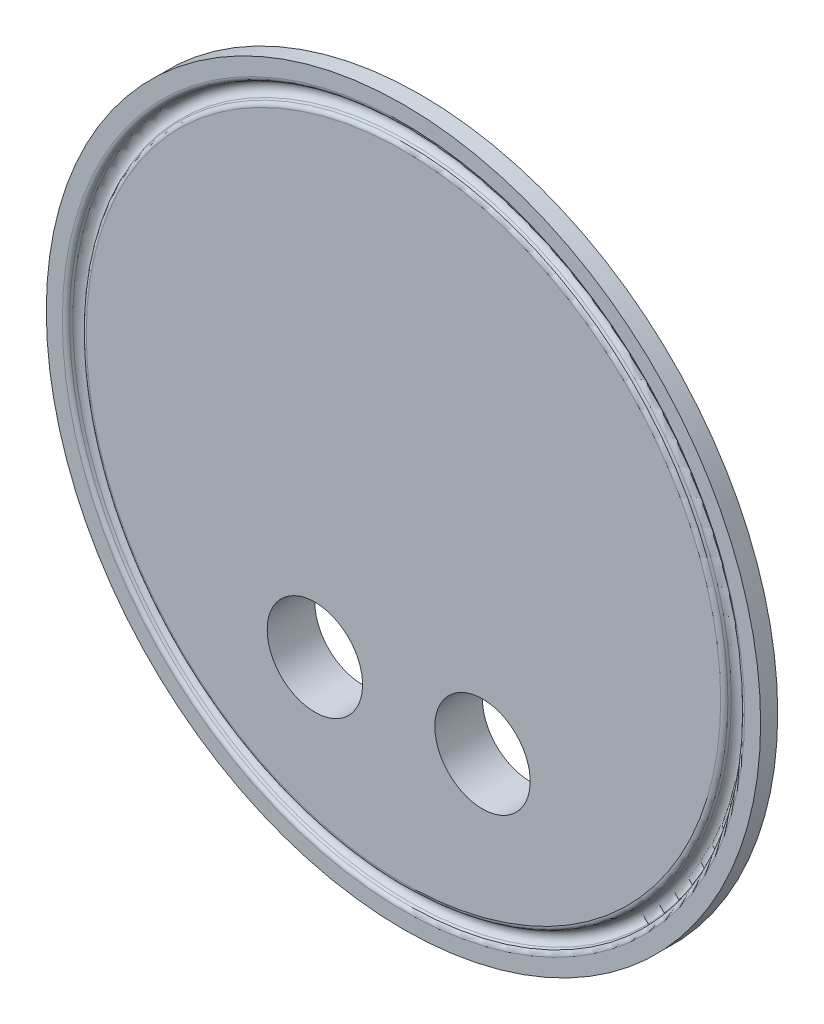
ISO-10303-21;
HEADER;
FILE_DESCRIPTION(('STEP AP214'),'2;1');
FILE_NAME('part.step','',(''),(''),'','','');
FILE_SCHEMA(('AUTOMOTIVE_DESIGN { 1 0 10303 214 1 1 1 1 }'));
ENDSEC;
DATA;
#1=APPLICATION_CONTEXT('core data for automotive mechanical design processes');
#2=APPLICATION_PROTOCOL_DEFINITION('international standard','automotive_design',2000,#1);
#3=PRODUCT_CONTEXT('',#1,'mechanical');
#4=PRODUCT('Part','Part','',(#3));
#5=PRODUCT_RELATED_PRODUCT_CATEGORY('part','',(#4));
#6=PRODUCT_DEFINITION_FORMATION('','',#4);
#7=PRODUCT_DEFINITION_CONTEXT('part definition',#1,'design');
#8=PRODUCT_DEFINITION('design','',#6,#7);
#9=PRODUCT_DEFINITION_SHAPE('','',#8);
#10=(LENGTH_UNIT() NAMED_UNIT(*) SI_UNIT(.MILLI.,.METRE.));
#11=(NAMED_UNIT(*) PLANE_ANGLE_UNIT() SI_UNIT($,.RADIAN.));
#12=(NAMED_UNIT(*) SI_UNIT($,.STERADIAN.) SOLID_ANGLE_UNIT());
#13=UNCERTAINTY_MEASURE_WITH_UNIT(LENGTH_MEASURE(1.E-05),#10,'distance_accuracy_value','');
#14=(GEOMETRIC_REPRESENTATION_CONTEXT(3) GLOBAL_UNCERTAINTY_ASSIGNED_CONTEXT((#13)) GLOBAL_UNIT_ASSIGNED_CONTEXT((#10,
#11,#12)) REPRESENTATION_CONTEXT('',''));
#15=CARTESIAN_POINT('',(0.,0.,0.));
#16=DIRECTION('',(0.,0.,1.));
#17=DIRECTION('',(1.,0.,0.));
#18=AXIS2_PLACEMENT_3D('',#15,#16,#17);
#19=CARTESIAN_POINT('',(0.,45.5042147091706,-7.9248));
#20=DIRECTION('',(0.,0.,1.));
#21=DIRECTION('',(1.,0.,0.));
#22=AXIS2_PLACEMENT_3D('',#19,#20,#21);
#23=PLANE('',#22);
#24=CARTESIAN_POINT('',(13.158980506847,-27.5862964842334,-7.9248));
#25=DIRECTION('',(0.,0.,-1.));
#26=DIRECTION('',(-1.,0.,0.));
#27=AXIS2_PLACEMENT_3D('',#24,#25,#26);
#28=CIRCLE('',#27,7.9375);
#29=CARTESIAN_POINT('',(5.22148050684697,-27.5862964842334,-7.9248));
#30=VERTEX_POINT('',#29);
#31=EDGE_CURVE('E98',#30,#30,#28,.T.);
#32=ORIENTED_EDGE('',*,*,#31,.F.);
#33=EDGE_LOOP('',(#32));
#34=FACE_BOUND('',#33,.T.);
#35=CARTESIAN_POINT('',(-14.7443998450213,-27.5862964842334,-7.9248));
#36=DIRECTION('',(0.,0.,-1.));
#37=DIRECTION('',(-1.,0.,0.));
#38=AXIS2_PLACEMENT_3D('',#35,#36,#37);
#39=CIRCLE('',#38,7.9375);
#40=CARTESIAN_POINT('',(-22.6818998450213,-27.5862964842334,-7.9248));
#41=VERTEX_POINT('',#40);
#42=EDGE_CURVE('E93',#41,#41,#39,.T.);
#43=ORIENTED_EDGE('',*,*,#42,.F.);
#44=EDGE_LOOP('',(#43));
#45=FACE_BOUND('',#44,.T.);
#46=CARTESIAN_POINT('',(0.,0.,-7.9248));
#47=DIRECTION('',(0.,0.,1.));
#48=DIRECTION('',(1.,0.,0.));
#49=AXIS2_PLACEMENT_3D('',#46,#47,#48);
#50=CIRCLE('',#49,45.5042147091706);
#51=CARTESIAN_POINT('',(45.5042147091706,0.,-7.9248));
#52=VERTEX_POINT('',#51);
#53=EDGE_CURVE('E11',#52,#52,#50,.T.);
#54=ORIENTED_EDGE('',*,*,#53,.F.);
#55=EDGE_LOOP('',(#54));
#56=FACE_BOUND('',#55,.T.);
#57=ADVANCED_FACE('F44',(#34,#45,#56),#23,.F.);
#58=CARTESIAN_POINT('',(0.,0.,-7.9248));
#59=DIRECTION('',(0.,0.,1.));
#60=DIRECTION('',(1.,0.,0.));
#61=AXIS2_PLACEMENT_3D('',#58,#59,#60);
#62=CONICAL_SURFACE('',#61,45.5042147091706,1.22173047639603);
#63=CARTESIAN_POINT('',(0.,0.,-2.8448));
#64=DIRECTION('',(0.,0.,1.));
#65=DIRECTION('',(1.,0.,0.));
#66=AXIS2_PLACEMENT_3D('',#63,#64,#65);
#67=CIRCLE('',#66,59.4614);
#68=CARTESIAN_POINT('',(59.4614,0.,-2.8448));
#69=VERTEX_POINT('',#68);
#70=EDGE_CURVE('E52',#69,#69,#67,.T.);
#71=ORIENTED_EDGE('',*,*,#70,.F.);
#72=EDGE_LOOP('',(#71));
#73=FACE_BOUND('',#72,.T.);
#74=ORIENTED_EDGE('',*,*,#53,.T.);
#75=EDGE_LOOP('',(#74));
#76=FACE_BOUND('',#75,.T.);
#77=ADVANCED_FACE('F120',(#73,#76),#62,.T.);
#78=CARTESIAN_POINT('',(0.,0.,0.));
#79=DIRECTION('',(0.,0.,1.));
#80=DIRECTION('',(1.,0.,0.));
#81=AXIS2_PLACEMENT_3D('',#78,#79,#80);
#82=CYLINDRICAL_SURFACE('',#81,59.4614);
#83=CARTESIAN_POINT('',(0.,0.,0.));
#84=DIRECTION('',(0.,0.,1.));
#85=DIRECTION('',(1.,0.,0.));
#86=AXIS2_PLACEMENT_3D('',#83,#84,#85);
#87=CIRCLE('',#86,59.4614);
#88=CARTESIAN_POINT('',(59.4614,0.,0.));
#89=VERTEX_POINT('',#88);
#90=EDGE_CURVE('E57',#89,#89,#87,.T.);
#91=ORIENTED_EDGE('',*,*,#90,.F.);
#92=EDGE_LOOP('',(#91));
#93=FACE_BOUND('',#92,.T.);
#94=ORIENTED_EDGE('',*,*,#70,.T.);
#95=EDGE_LOOP('',(#94));
#96=FACE_BOUND('',#95,.T.);
#97=ADVANCED_FACE('F157',(#93,#96),#82,.T.);
#98=CARTESIAN_POINT('',(0.,56.7910722747395,0.));
#99=DIRECTION('',(0.,0.,-1.));
#100=DIRECTION('',(-1.,0.,0.));
#101=AXIS2_PLACEMENT_3D('',#98,#99,#100);
#102=PLANE('',#101);
#103=CARTESIAN_POINT('',(0.,0.,0.));
#104=DIRECTION('',(0.,0.,1.));
#105=DIRECTION('',(1.,0.,0.));
#106=AXIS2_PLACEMENT_3D('',#103,#104,#105);
#107=CIRCLE('',#106,56.7910722747395);
#108=CARTESIAN_POINT('',(56.7910722747395,0.,0.));
#109=VERTEX_POINT('',#108);
#110=EDGE_CURVE('E62',#109,#109,#107,.T.);
#111=ORIENTED_EDGE('',*,*,#110,.F.);
#112=EDGE_LOOP('',(#111));
#113=FACE_BOUND('',#112,.T.);
#114=ORIENTED_EDGE('',*,*,#90,.T.);
#115=EDGE_LOOP('',(#114));
#116=FACE_BOUND('',#115,.T.);
#117=ADVANCED_FACE('F153',(#113,#116),#102,.F.);
#118=CARTESIAN_POINT('',(0.,0.,-0.7874));
#119=DIRECTION('',(0.,0.,1.));
#120=DIRECTION('',(1.,0.,0.));
#121=AXIS2_PLACEMENT_3D('',#118,#119,#120);
#122=TOROIDAL_SURFACE('',#121,56.7910722747395,0.7874);
#123=CARTESIAN_POINT('',(0.,0.,-0.479738309427547));
#124=DIRECTION('',(0.,0.,1.));
#125=DIRECTION('',(1.,0.,0.));
#126=AXIS2_PLACEMENT_3D('',#123,#124,#125);
#127=CIRCLE('',#126,56.0662667531311);
#128=CARTESIAN_POINT('',(56.0662667531311,0.,-0.479738309427547));
#129=VERTEX_POINT('',#128);
#130=EDGE_CURVE('E68',#129,#129,#127,.T.);
#131=ORIENTED_EDGE('',*,*,#130,.F.);
#132=EDGE_LOOP('',(#131));
#133=FACE_BOUND('',#132,.T.);
#134=ORIENTED_EDGE('',*,*,#110,.T.);
#135=EDGE_LOOP('',(#134));
#136=FACE_BOUND('',#135,.T.);
#137=ADVANCED_FACE('F149',(#133,#136),#122,.T.);
#138=CARTESIAN_POINT('',(0.,0.,-0.479738309427547));
#139=DIRECTION('',(0.,0.,1.));
#140=DIRECTION('',(1.,0.,0.));
#141=AXIS2_PLACEMENT_3D('',#138,#139,#140);
#142=CONICAL_SURFACE('',#141,56.0662667531311,0.401425727958702);
#143=CARTESIAN_POINT('',(0.,0.,-0.872854821190493));
#144=DIRECTION('',(0.,0.,1.));
#145=DIRECTION('',(1.,0.,0.));
#146=AXIS2_PLACEMENT_3D('',#143,#144,#145);
#147=CIRCLE('',#146,55.8993986940515);
#148=CARTESIAN_POINT('',(55.8993986940515,0.,-0.872854821190493));
#149=VERTEX_POINT('',#148);
#150=EDGE_CURVE('E72',#149,#149,#147,.T.);
#151=ORIENTED_EDGE('',*,*,#150,.F.);
#152=EDGE_LOOP('',(#151));
#153=FACE_BOUND('',#152,.T.);
#154=ORIENTED_EDGE('',*,*,#130,.T.);
#155=EDGE_LOOP('',(#154));
#156=FACE_BOUND('',#155,.T.);
#157=ADVANCED_FACE('F145',(#153,#156),#142,.F.);
#158=CARTESIAN_POINT('',(0.,0.,-0.4064));
#159=DIRECTION('',(0.,0.,1.));
#160=DIRECTION('',(1.,0.,0.));
#161=AXIS2_PLACEMENT_3D('',#158,#159,#160);
#162=TOROIDAL_SURFACE('',#161,54.8005,1.1938);
#163=CARTESIAN_POINT('',(0.,0.,-0.872854821190503));
#164=DIRECTION('',(0.,0.,1.));
#165=DIRECTION('',(1.,0.,0.));
#166=AXIS2_PLACEMENT_3D('',#163,#164,#165);
#167=CIRCLE('',#166,53.7016013059485);
#168=CARTESIAN_POINT('',(53.7016013059485,0.,-0.872854821190503));
#169=VERTEX_POINT('',#168);
#170=EDGE_CURVE('E76',#169,#169,#167,.T.);
#171=ORIENTED_EDGE('',*,*,#170,.F.);
#172=EDGE_LOOP('',(#171));
#173=FACE_BOUND('',#172,.T.);
#174=ORIENTED_EDGE('',*,*,#150,.T.);
#175=EDGE_LOOP('',(#174));
#176=FACE_BOUND('',#175,.T.);
#177=ADVANCED_FACE('F141',(#173,#176),#162,.F.);
#178=CARTESIAN_POINT('',(0.,0.,-0.872854821190503));
#179=DIRECTION('',(0.,0.,-1.));
#180=DIRECTION('',(-1.,0.,0.));
#181=AXIS2_PLACEMENT_3D('',#178,#179,#180);
#182=CONICAL_SURFACE('',#181,53.7016013059485,0.401425727958718);
#183=CARTESIAN_POINT('',(0.,0.,-0.479738309427541));
#184=DIRECTION('',(0.,0.,1.));
#185=DIRECTION('',(1.,0.,0.));
#186=AXIS2_PLACEMENT_3D('',#183,#184,#185);
#187=CIRCLE('',#186,53.5347332468689);
#188=CARTESIAN_POINT('',(53.5347332468689,0.,-0.479738309427541));
#189=VERTEX_POINT('',#188);
#190=EDGE_CURVE('E80',#189,#189,#187,.T.);
#191=ORIENTED_EDGE('',*,*,#190,.F.);
#192=EDGE_LOOP('',(#191));
#193=FACE_BOUND('',#192,.T.);
#194=ORIENTED_EDGE('',*,*,#170,.T.);
#195=EDGE_LOOP('',(#194));
#196=FACE_BOUND('',#195,.T.);
#197=ADVANCED_FACE('F137',(#193,#196),#182,.T.);
#198=CARTESIAN_POINT('',(0.,0.,-0.7874));
#199=DIRECTION('',(0.,0.,1.));
#200=DIRECTION('',(1.,0.,0.));
#201=AXIS2_PLACEMENT_3D('',#198,#199,#200);
#202=TOROIDAL_SURFACE('',#201,52.8099277252605,0.787400000000005);
#203=CARTESIAN_POINT('',(0.,0.,0.));
#204=DIRECTION('',(0.,0.,1.));
#205=DIRECTION('',(1.,0.,0.));
#206=AXIS2_PLACEMENT_3D('',#203,#204,#205);
#207=CIRCLE('',#206,52.8099277252605);
#208=CARTESIAN_POINT('',(52.8099277252605,0.,0.));
#209=VERTEX_POINT('',#208);
#210=EDGE_CURVE('E84',#209,#209,#207,.T.);
#211=ORIENTED_EDGE('',*,*,#210,.F.);
#212=EDGE_LOOP('',(#211));
#213=FACE_BOUND('',#212,.T.);
#214=ORIENTED_EDGE('',*,*,#190,.T.);
#215=EDGE_LOOP('',(#214));
#216=FACE_BOUND('',#215,.T.);
#217=ADVANCED_FACE('F131',(#213,#216),#202,.T.);
#218=CARTESIAN_POINT('',(0.,0.,0.));
#219=DIRECTION('',(0.,0.,-1.));
#220=DIRECTION('',(-1.,0.,0.));
#221=AXIS2_PLACEMENT_3D('',#218,#219,#220);
#222=PLANE('',#221);
#223=CARTESIAN_POINT('',(13.158980506847,-27.5862964842334,0.));
#224=DIRECTION('',(0.,0.,-1.));
#225=DIRECTION('',(-1.,0.,0.));
#226=AXIS2_PLACEMENT_3D('',#223,#224,#225);
#227=CIRCLE('',#226,7.9375);
#228=CARTESIAN_POINT('',(5.22148050684697,-27.5862964842334,0.));
#229=VERTEX_POINT('',#228);
#230=EDGE_CURVE('E88',#229,#229,#227,.T.);
#231=ORIENTED_EDGE('',*,*,#230,.T.);
#232=EDGE_LOOP('',(#231));
#233=FACE_BOUND('',#232,.T.);
#234=CARTESIAN_POINT('',(-14.7443998450213,-27.5862964842334,0.));
#235=DIRECTION('',(0.,0.,-1.));
#236=DIRECTION('',(-1.,0.,0.));
#237=AXIS2_PLACEMENT_3D('',#234,#235,#236);
#238=CIRCLE('',#237,7.9375);
#239=CARTESIAN_POINT('',(-22.6818998450213,-27.5862964842334,0.));
#240=VERTEX_POINT('',#239);
#241=EDGE_CURVE('E89',#240,#240,#238,.T.);
#242=ORIENTED_EDGE('',*,*,#241,.T.);
#243=EDGE_LOOP('',(#242));
#244=FACE_BOUND('',#243,.T.);
#245=ORIENTED_EDGE('',*,*,#210,.T.);
#246=EDGE_LOOP('',(#245));
#247=FACE_BOUND('',#246,.T.);
#248=ADVANCED_FACE('F108',(#233,#244,#247),#222,.F.);
#249=CARTESIAN_POINT('',(-14.7443998450213,-27.5862964842334,0.));
#250=DIRECTION('',(0.,0.,-1.));
#251=DIRECTION('',(-1.,0.,0.));
#252=AXIS2_PLACEMENT_3D('',#249,#250,#251);
#253=CYLINDRICAL_SURFACE('',#252,7.9375);
#254=ORIENTED_EDGE('',*,*,#241,.F.);
#255=EDGE_LOOP('',(#254));
#256=FACE_BOUND('',#255,.T.);
#257=ORIENTED_EDGE('',*,*,#42,.T.);
#258=EDGE_LOOP('',(#257));
#259=FACE_BOUND('',#258,.T.);
#260=ADVANCED_FACE('F114',(#256,#259),#253,.F.);
#261=CARTESIAN_POINT('',(13.158980506847,-27.5862964842334,0.));
#262=DIRECTION('',(0.,0.,-1.));
#263=DIRECTION('',(-1.,0.,0.));
#264=AXIS2_PLACEMENT_3D('',#261,#262,#263);
#265=CYLINDRICAL_SURFACE('',#264,7.9375);
#266=ORIENTED_EDGE('',*,*,#230,.F.);
#267=EDGE_LOOP('',(#266));
#268=FACE_BOUND('',#267,.T.);
#269=ORIENTED_EDGE('',*,*,#31,.T.);
#270=EDGE_LOOP('',(#269));
#271=FACE_BOUND('',#270,.T.);
#272=ADVANCED_FACE('F111',(#268,#271),#265,.F.);
#273=CLOSED_SHELL('',(#57,#77,#97,#117,#137,#157,#177,#197,#217,#248,#260,#272));
#274=MANIFOLD_SOLID_BREP('B2',#273);
#275=ADVANCED_BREP_SHAPE_REPRESENTATION('',(#18,#274),#14);
#276=SHAPE_DEFINITION_REPRESENTATION(#9,#275);
ENDSEC;
END-ISO-10303-21;
